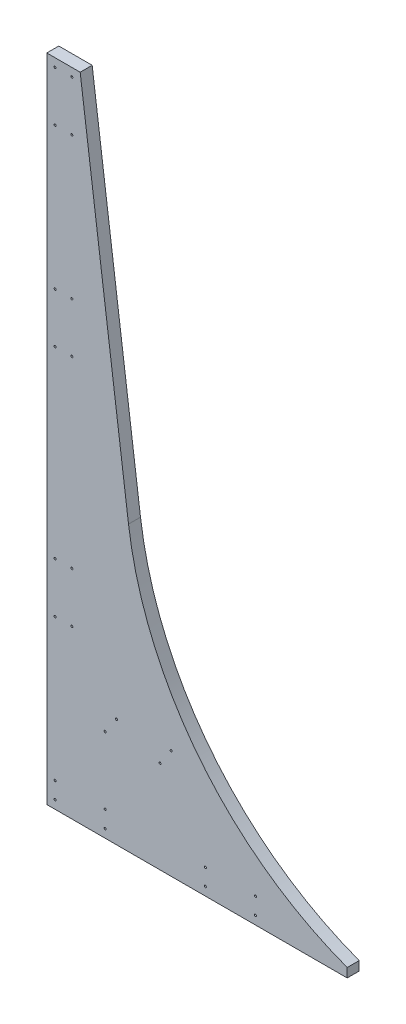
ISO-10303-21;
HEADER;
FILE_DESCRIPTION(('STEP AP214'),'2;1');
FILE_NAME('part.step','',(''),(''),'','','');
FILE_SCHEMA(('AUTOMOTIVE_DESIGN { 1 0 10303 214 1 1 1 1 }'));
ENDSEC;
DATA;
#1=APPLICATION_CONTEXT('core data for automotive mechanical design processes');
#2=APPLICATION_PROTOCOL_DEFINITION('international standard','automotive_design',2000,#1);
#3=PRODUCT_CONTEXT('',#1,'mechanical');
#4=PRODUCT('Part','Part','',(#3));
#5=PRODUCT_RELATED_PRODUCT_CATEGORY('part','',(#4));
#6=PRODUCT_DEFINITION_FORMATION('','',#4);
#7=PRODUCT_DEFINITION_CONTEXT('part definition',#1,'design');
#8=PRODUCT_DEFINITION('design','',#6,#7);
#9=PRODUCT_DEFINITION_SHAPE('','',#8);
#10=(LENGTH_UNIT() NAMED_UNIT(*) SI_UNIT(.MILLI.,.METRE.));
#11=(NAMED_UNIT(*) PLANE_ANGLE_UNIT() SI_UNIT($,.RADIAN.));
#12=(NAMED_UNIT(*) SI_UNIT($,.STERADIAN.) SOLID_ANGLE_UNIT());
#13=UNCERTAINTY_MEASURE_WITH_UNIT(LENGTH_MEASURE(1.E-05),#10,'distance_accuracy_value','');
#14=(GEOMETRIC_REPRESENTATION_CONTEXT(3) GLOBAL_UNCERTAINTY_ASSIGNED_CONTEXT((#13)) GLOBAL_UNIT_ASSIGNED_CONTEXT((#10,
#11,#12)) REPRESENTATION_CONTEXT('',''));
#15=CARTESIAN_POINT('',(0.,0.,0.));
#16=DIRECTION('',(0.,0.,1.));
#17=DIRECTION('',(1.,0.,0.));
#18=AXIS2_PLACEMENT_3D('',#15,#16,#17);
#19=CARTESIAN_POINT('',(638.116559349375,499.436357901165,18.25625));
#20=DIRECTION('',(0.,0.,-1.));
#21=DIRECTION('',(-1.,0.,0.));
#22=AXIS2_PLACEMENT_3D('',#19,#20,#21);
#23=CYLINDRICAL_SURFACE('',#22,518.182264806593);
#24=CARTESIAN_POINT('',(638.116559349375,499.436357901165,0.));
#25=DIRECTION('',(0.,0.,1.));
#26=DIRECTION('',(1.,0.,0.));
#27=AXIS2_PLACEMENT_3D('',#24,#25,#26);
#28=CIRCLE('',#27,518.182264806593);
#29=CARTESIAN_POINT('',(124.367415651835,431.8,0.));
#30=VERTEX_POINT('',#29);
#31=CARTESIAN_POINT('',(457.201,13.8620382080899,0.));
#32=VERTEX_POINT('',#31);
#33=EDGE_CURVE('E152',#30,#32,#28,.T.);
#34=ORIENTED_EDGE('',*,*,#33,.F.);
#35=DIRECTION('',(0.,0.,-1.));
#36=VECTOR('',#35,1.);
#37=CARTESIAN_POINT('',(124.367415651835,431.8,18.25625));
#38=LINE('',#37,#36);
#39=CARTESIAN_POINT('',(124.367415651835,431.8,18.25625));
#40=VERTEX_POINT('',#39);
#41=EDGE_CURVE('E13',#40,#30,#38,.T.);
#42=ORIENTED_EDGE('',*,*,#41,.F.);
#43=CARTESIAN_POINT('',(638.116559349375,499.436357901165,18.25625));
#44=DIRECTION('',(0.,0.,1.));
#45=DIRECTION('',(1.,0.,0.));
#46=AXIS2_PLACEMENT_3D('',#43,#44,#45);
#47=CIRCLE('',#46,518.182264806593);
#48=CARTESIAN_POINT('',(457.201,13.8620382080899,18.25625));
#49=VERTEX_POINT('',#48);
#50=EDGE_CURVE('E173',#40,#49,#47,.T.);
#51=ORIENTED_EDGE('',*,*,#50,.T.);
#52=DIRECTION('',(0.,0.,-1.));
#53=VECTOR('',#52,1.);
#54=CARTESIAN_POINT('',(457.201,13.8620382080899,18.25625));
#55=LINE('',#54,#53);
#56=EDGE_CURVE('E75',#49,#32,#55,.T.);
#57=ORIENTED_EDGE('',*,*,#56,.T.);
#58=EDGE_LOOP('',(#34,#42,#51,#57));
#59=FACE_BOUND('',#58,.T.);
#60=ADVANCED_FACE('F58',(#59),#23,.F.);
#61=CARTESIAN_POINT('',(178.127589027018,23.4509419846275,18.25625));
#62=DIRECTION('',(0.991444861373811,0.130526192220048,0.));
#63=DIRECTION('',(-0.130526192220048,0.991444861373811,0.));
#64=AXIS2_PLACEMENT_3D('',#61,#62,#63);
#65=PLANE('',#64);
#66=DIRECTION('',(0.130526192220048,-0.991444861373811,0.));
#67=VECTOR('',#66,1.);
#68=CARTESIAN_POINT('',(178.127589027018,23.4509419846275,0.));
#69=LINE('',#68,#67);
#70=CARTESIAN_POINT('',(50.8,990.6,0.));
#71=VERTEX_POINT('',#70);
#72=EDGE_CURVE('E155',#71,#30,#69,.T.);
#73=ORIENTED_EDGE('',*,*,#72,.F.);
#74=DIRECTION('',(0.,0.,-1.));
#75=VECTOR('',#74,1.);
#76=CARTESIAN_POINT('',(50.8,990.6,18.25625));
#77=LINE('',#76,#75);
#78=CARTESIAN_POINT('',(50.8,990.6,18.25625));
#79=VERTEX_POINT('',#78);
#80=EDGE_CURVE('E67',#79,#71,#77,.T.);
#81=ORIENTED_EDGE('',*,*,#80,.F.);
#82=DIRECTION('',(0.130526192220048,-0.991444861373811,0.));
#83=VECTOR('',#82,1.);
#84=CARTESIAN_POINT('',(178.127589027018,23.4509419846275,18.25625));
#85=LINE('',#84,#83);
#86=EDGE_CURVE('E146',#79,#40,#85,.T.);
#87=ORIENTED_EDGE('',*,*,#86,.T.);
#88=ORIENTED_EDGE('',*,*,#41,.T.);
#89=EDGE_LOOP('',(#73,#81,#87,#88));
#90=FACE_BOUND('',#89,.T.);
#91=ADVANCED_FACE('F186',(#90),#65,.T.);
#92=CARTESIAN_POINT('',(0.,990.6,18.25625));
#93=DIRECTION('',(0.,1.,0.));
#94=DIRECTION('',(0.,0.,1.));
#95=AXIS2_PLACEMENT_3D('',#92,#93,#94);
#96=PLANE('',#95);
#97=DIRECTION('',(1.,0.,0.));
#98=VECTOR('',#97,1.);
#99=CARTESIAN_POINT('',(0.,990.6,0.));
#100=LINE('',#99,#98);
#101=CARTESIAN_POINT('',(0.,990.6,0.));
#102=VERTEX_POINT('',#101);
#103=EDGE_CURVE('E160',#102,#71,#100,.T.);
#104=ORIENTED_EDGE('',*,*,#103,.F.);
#105=DIRECTION('',(0.,0.,-1.));
#106=VECTOR('',#105,1.);
#107=CARTESIAN_POINT('',(0.,990.6,18.25625));
#108=LINE('',#107,#106);
#109=CARTESIAN_POINT('',(0.,990.6,18.25625));
#110=VERTEX_POINT('',#109);
#111=EDGE_CURVE('E129',#110,#102,#108,.T.);
#112=ORIENTED_EDGE('',*,*,#111,.F.);
#113=DIRECTION('',(1.,0.,0.));
#114=VECTOR('',#113,1.);
#115=CARTESIAN_POINT('',(0.,990.6,18.25625));
#116=LINE('',#115,#114);
#117=EDGE_CURVE('E142',#110,#79,#116,.T.);
#118=ORIENTED_EDGE('',*,*,#117,.T.);
#119=ORIENTED_EDGE('',*,*,#80,.T.);
#120=EDGE_LOOP('',(#104,#112,#118,#119));
#121=FACE_BOUND('',#120,.T.);
#122=ADVANCED_FACE('F183',(#121),#96,.T.);
#123=CARTESIAN_POINT('',(0.,0.,18.25625));
#124=DIRECTION('',(-1.,0.,0.));
#125=DIRECTION('',(0.,0.,1.));
#126=AXIS2_PLACEMENT_3D('',#123,#124,#125);
#127=PLANE('',#126);
#128=DIRECTION('',(0.,1.,0.));
#129=VECTOR('',#128,1.);
#130=CARTESIAN_POINT('',(0.,0.,0.));
#131=LINE('',#130,#129);
#132=CARTESIAN_POINT('',(0.,0.,0.));
#133=VERTEX_POINT('',#132);
#134=EDGE_CURVE('E125',#133,#102,#131,.T.);
#135=ORIENTED_EDGE('',*,*,#134,.F.);
#136=DIRECTION('',(0.,0.,-1.));
#137=VECTOR('',#136,1.);
#138=CARTESIAN_POINT('',(0.,0.,18.25625));
#139=LINE('',#138,#137);
#140=CARTESIAN_POINT('',(0.,0.,18.25625));
#141=VERTEX_POINT('',#140);
#142=EDGE_CURVE('E119',#141,#133,#139,.T.);
#143=ORIENTED_EDGE('',*,*,#142,.F.);
#144=DIRECTION('',(0.,1.,0.));
#145=VECTOR('',#144,1.);
#146=CARTESIAN_POINT('',(0.,0.,18.25625));
#147=LINE('',#146,#145);
#148=EDGE_CURVE('E123',#141,#110,#147,.T.);
#149=ORIENTED_EDGE('',*,*,#148,.T.);
#150=ORIENTED_EDGE('',*,*,#111,.T.);
#151=EDGE_LOOP('',(#135,#143,#149,#150));
#152=FACE_BOUND('',#151,.T.);
#153=ADVANCED_FACE('F121',(#152),#127,.T.);
#154=CARTESIAN_POINT('',(0.,0.,18.25625));
#155=DIRECTION('',(0.,1.,0.));
#156=DIRECTION('',(0.,0.,1.));
#157=AXIS2_PLACEMENT_3D('',#154,#155,#156);
#158=PLANE('',#157);
#159=DIRECTION('',(1.,0.,0.));
#160=VECTOR('',#159,1.);
#161=CARTESIAN_POINT('',(0.,0.,0.));
#162=LINE('',#161,#160);
#163=CARTESIAN_POINT('',(457.201,0.,0.));
#164=VERTEX_POINT('',#163);
#165=EDGE_CURVE('E166',#133,#164,#162,.T.);
#166=ORIENTED_EDGE('',*,*,#165,.T.);
#167=DIRECTION('',(0.,0.,-1.));
#168=VECTOR('',#167,1.);
#169=CARTESIAN_POINT('',(457.201,0.,18.25625));
#170=LINE('',#169,#168);
#171=CARTESIAN_POINT('',(457.201,0.,18.25625));
#172=VERTEX_POINT('',#171);
#173=EDGE_CURVE('E97',#172,#164,#170,.T.);
#174=ORIENTED_EDGE('',*,*,#173,.F.);
#175=DIRECTION('',(1.,0.,0.));
#176=VECTOR('',#175,1.);
#177=CARTESIAN_POINT('',(0.,0.,18.25625));
#178=LINE('',#177,#176);
#179=EDGE_CURVE('E131',#141,#172,#178,.T.);
#180=ORIENTED_EDGE('',*,*,#179,.F.);
#181=ORIENTED_EDGE('',*,*,#142,.T.);
#182=EDGE_LOOP('',(#166,#174,#180,#181));
#183=FACE_BOUND('',#182,.T.);
#184=ADVANCED_FACE('F132',(#183),#158,.F.);
#185=CARTESIAN_POINT('',(457.201,0.,18.25625));
#186=DIRECTION('',(1.,0.,0.));
#187=DIRECTION('',(0.,0.,-1.));
#188=AXIS2_PLACEMENT_3D('',#185,#186,#187);
#189=PLANE('',#188);
#190=DIRECTION('',(0.,-1.,0.));
#191=VECTOR('',#190,1.);
#192=CARTESIAN_POINT('',(457.201,0.,0.));
#193=LINE('',#192,#191);
#194=EDGE_CURVE('E169',#32,#164,#193,.T.);
#195=ORIENTED_EDGE('',*,*,#194,.F.);
#196=ORIENTED_EDGE('',*,*,#56,.F.);
#197=DIRECTION('',(0.,-1.,0.));
#198=VECTOR('',#197,1.);
#199=CARTESIAN_POINT('',(457.201,0.,18.25625));
#200=LINE('',#199,#198);
#201=EDGE_CURVE('E136',#49,#172,#200,.T.);
#202=ORIENTED_EDGE('',*,*,#201,.T.);
#203=ORIENTED_EDGE('',*,*,#173,.T.);
#204=EDGE_LOOP('',(#195,#196,#202,#203));
#205=FACE_BOUND('',#204,.T.);
#206=ADVANCED_FACE('F189',(#205),#189,.T.);
#207=CARTESIAN_POINT('',(0.,0.,18.25625));
#208=DIRECTION('',(0.,0.,1.));
#209=DIRECTION('',(1.,0.,0.));
#210=AXIS2_PLACEMENT_3D('',#207,#208,#209);
#211=PLANE('',#210);
#212=CARTESIAN_POINT('',(88.9,140.661027566061,18.25625));
#213=DIRECTION('',(0.,0.,1.));
#214=DIRECTION('',(1.,0.,0.));
#215=AXIS2_PLACEMENT_3D('',#212,#213,#214);
#216=CIRCLE('',#215,1.5875);
#217=CARTESIAN_POINT('',(90.4875,140.661027566061,18.25625));
#218=VERTEX_POINT('',#217);
#219=EDGE_CURVE('E737',#218,#218,#216,.T.);
#220=ORIENTED_EDGE('',*,*,#219,.F.);
#221=EDGE_LOOP('',(#220));
#222=FACE_BOUND('',#221,.T.);
#223=CARTESIAN_POINT('',(106.1212,165.426027566061,18.25625));
#224=DIRECTION('',(0.,0.,1.));
#225=DIRECTION('',(1.,0.,0.));
#226=AXIS2_PLACEMENT_3D('',#223,#224,#225);
#227=CIRCLE('',#226,1.58749999999999);
#228=CARTESIAN_POINT('',(107.7087,165.426027566061,18.25625));
#229=VERTEX_POINT('',#228);
#230=EDGE_CURVE('E731',#229,#229,#227,.T.);
#231=ORIENTED_EDGE('',*,*,#230,.F.);
#232=EDGE_LOOP('',(#231));
#233=FACE_BOUND('',#232,.T.);
#234=CARTESIAN_POINT('',(189.3316,165.426027566061,18.25625));
#235=DIRECTION('',(0.,0.,1.));
#236=DIRECTION('',(1.,0.,0.));
#237=AXIS2_PLACEMENT_3D('',#234,#235,#236);
#238=CIRCLE('',#237,1.58749999999999);
#239=CARTESIAN_POINT('',(190.9191,165.426027566061,18.25625));
#240=VERTEX_POINT('',#239);
#241=EDGE_CURVE('E725',#240,#240,#238,.T.);
#242=ORIENTED_EDGE('',*,*,#241,.F.);
#243=EDGE_LOOP('',(#242));
#244=FACE_BOUND('',#243,.T.);
#245=CARTESIAN_POINT('',(172.1104,140.661027566061,18.25625));
#246=DIRECTION('',(0.,0.,1.));
#247=DIRECTION('',(1.,0.,0.));
#248=AXIS2_PLACEMENT_3D('',#245,#246,#247);
#249=CIRCLE('',#248,1.58749999999999);
#250=CARTESIAN_POINT('',(173.6979,140.661027566061,18.25625));
#251=VERTEX_POINT('',#250);
#252=EDGE_CURVE('E719',#251,#251,#249,.T.);
#253=ORIENTED_EDGE('',*,*,#252,.F.);
#254=EDGE_LOOP('',(#253));
#255=FACE_BOUND('',#254,.T.);
#256=CARTESIAN_POINT('',(12.7000000000001,38.0999999999999,18.25625));
#257=DIRECTION('',(0.,0.,1.));
#258=DIRECTION('',(1.,0.,0.));
#259=AXIS2_PLACEMENT_3D('',#256,#257,#258);
#260=CIRCLE('',#259,1.5875);
#261=CARTESIAN_POINT('',(14.2875000000001,38.0999999999999,18.25625));
#262=VERTEX_POINT('',#261);
#263=EDGE_CURVE('E665',#262,#262,#260,.T.);
#264=ORIENTED_EDGE('',*,*,#263,.F.);
#265=EDGE_LOOP('',(#264));
#266=FACE_BOUND('',#265,.T.);
#267=CARTESIAN_POINT('',(38.1000000000001,330.2,18.25625));
#268=DIRECTION('',(0.,0.,1.));
#269=DIRECTION('',(1.,0.,0.));
#270=AXIS2_PLACEMENT_3D('',#267,#268,#269);
#271=CIRCLE('',#270,1.58750000000001);
#272=CARTESIAN_POINT('',(39.6875000000001,330.2,18.25625));
#273=VERTEX_POINT('',#272);
#274=EDGE_CURVE('E671',#273,#273,#271,.T.);
#275=ORIENTED_EDGE('',*,*,#274,.F.);
#276=EDGE_LOOP('',(#275));
#277=FACE_BOUND('',#276,.T.);
#278=CARTESIAN_POINT('',(12.7000000000001,330.2,18.25625));
#279=DIRECTION('',(0.,0.,1.));
#280=DIRECTION('',(1.,0.,0.));
#281=AXIS2_PLACEMENT_3D('',#278,#279,#280);
#282=CIRCLE('',#281,1.5875);
#283=CARTESIAN_POINT('',(14.2875000000001,330.2,18.25625));
#284=VERTEX_POINT('',#283);
#285=EDGE_CURVE('E653',#284,#284,#282,.T.);
#286=ORIENTED_EDGE('',*,*,#285,.F.);
#287=EDGE_LOOP('',(#286));
#288=FACE_BOUND('',#287,.T.);
#289=CARTESIAN_POINT('',(38.1000000000001,254.,18.25625));
#290=DIRECTION('',(0.,0.,1.));
#291=DIRECTION('',(1.,0.,0.));
#292=AXIS2_PLACEMENT_3D('',#289,#290,#291);
#293=CIRCLE('',#292,1.58750000000006);
#294=CARTESIAN_POINT('',(39.6875000000001,254.,18.25625));
#295=VERTEX_POINT('',#294);
#296=EDGE_CURVE('E659',#295,#295,#293,.T.);
#297=ORIENTED_EDGE('',*,*,#296,.F.);
#298=EDGE_LOOP('',(#297));
#299=FACE_BOUND('',#298,.T.);
#300=CARTESIAN_POINT('',(241.3,38.0999999999999,18.25625));
#301=DIRECTION('',(0.,0.,1.));
#302=DIRECTION('',(1.,0.,0.));
#303=AXIS2_PLACEMENT_3D('',#300,#301,#302);
#304=CIRCLE('',#303,1.58749999999999);
#305=CARTESIAN_POINT('',(242.8875,38.0999999999999,18.25625));
#306=VERTEX_POINT('',#305);
#307=EDGE_CURVE('E689',#306,#306,#304,.T.);
#308=ORIENTED_EDGE('',*,*,#307,.F.);
#309=EDGE_LOOP('',(#308));
#310=FACE_BOUND('',#309,.T.);
#311=CARTESIAN_POINT('',(88.9000000000001,12.6999999999999,18.25625));
#312=DIRECTION('',(0.,0.,1.));
#313=DIRECTION('',(1.,0.,0.));
#314=AXIS2_PLACEMENT_3D('',#311,#312,#313);
#315=CIRCLE('',#314,1.58749999999998);
#316=CARTESIAN_POINT('',(90.4875000000001,12.6999999999999,18.25625));
#317=VERTEX_POINT('',#316);
#318=EDGE_CURVE('E695',#317,#317,#315,.T.);
#319=ORIENTED_EDGE('',*,*,#318,.F.);
#320=EDGE_LOOP('',(#319));
#321=FACE_BOUND('',#320,.T.);
#322=CARTESIAN_POINT('',(88.9000000000001,38.0999999999999,18.25625));
#323=DIRECTION('',(0.,0.,1.));
#324=DIRECTION('',(1.,0.,0.));
#325=AXIS2_PLACEMENT_3D('',#322,#323,#324);
#326=CIRCLE('',#325,1.58749999999999);
#327=CARTESIAN_POINT('',(90.4875000000001,38.0999999999999,18.25625));
#328=VERTEX_POINT('',#327);
#329=EDGE_CURVE('E677',#328,#328,#326,.T.);
#330=ORIENTED_EDGE('',*,*,#329,.F.);
#331=EDGE_LOOP('',(#330));
#332=FACE_BOUND('',#331,.T.);
#333=CARTESIAN_POINT('',(12.7000000000001,12.6999999999999,18.25625));
#334=DIRECTION('',(0.,0.,1.));
#335=DIRECTION('',(1.,0.,0.));
#336=AXIS2_PLACEMENT_3D('',#333,#334,#335);
#337=CIRCLE('',#336,1.5875);
#338=CARTESIAN_POINT('',(14.2875000000001,12.6999999999999,18.25625));
#339=VERTEX_POINT('',#338);
#340=EDGE_CURVE('E683',#339,#339,#337,.T.);
#341=ORIENTED_EDGE('',*,*,#340,.F.);
#342=EDGE_LOOP('',(#341));
#343=FACE_BOUND('',#342,.T.);
#344=CARTESIAN_POINT('',(12.7,609.6,18.25625));
#345=DIRECTION('',(0.,0.,1.));
#346=DIRECTION('',(1.,0.,0.));
#347=AXIS2_PLACEMENT_3D('',#344,#345,#346);
#348=CIRCLE('',#347,1.58750000000007);
#349=CARTESIAN_POINT('',(14.2875000000001,609.6,18.25625));
#350=VERTEX_POINT('',#349);
#351=EDGE_CURVE('E617',#350,#350,#348,.T.);
#352=ORIENTED_EDGE('',*,*,#351,.F.);
#353=EDGE_LOOP('',(#352));
#354=FACE_BOUND('',#353,.T.);
#355=CARTESIAN_POINT('',(38.1,901.7,18.25625));
#356=DIRECTION('',(0.,0.,1.));
#357=DIRECTION('',(1.,0.,0.));
#358=AXIS2_PLACEMENT_3D('',#355,#356,#357);
#359=CIRCLE('',#358,1.58750000000008);
#360=CARTESIAN_POINT('',(39.6875000000001,901.7,18.25625));
#361=VERTEX_POINT('',#360);
#362=EDGE_CURVE('E623',#361,#361,#359,.T.);
#363=ORIENTED_EDGE('',*,*,#362,.F.);
#364=EDGE_LOOP('',(#363));
#365=FACE_BOUND('',#364,.T.);
#366=CARTESIAN_POINT('',(12.7,901.7,18.25625));
#367=DIRECTION('',(0.,0.,1.));
#368=DIRECTION('',(1.,0.,0.));
#369=AXIS2_PLACEMENT_3D('',#366,#367,#368);
#370=CIRCLE('',#369,1.58750000000007);
#371=CARTESIAN_POINT('',(14.2875000000001,901.7,18.25625));
#372=VERTEX_POINT('',#371);
#373=EDGE_CURVE('E602',#372,#372,#370,.T.);
#374=ORIENTED_EDGE('',*,*,#373,.F.);
#375=EDGE_LOOP('',(#374));
#376=FACE_BOUND('',#375,.T.);
#377=CARTESIAN_POINT('',(38.1,977.9,18.25625));
#378=DIRECTION('',(0.,0.,1.));
#379=DIRECTION('',(1.,0.,0.));
#380=AXIS2_PLACEMENT_3D('',#377,#378,#379);
#381=CIRCLE('',#380,1.58750000000007);
#382=CARTESIAN_POINT('',(39.6875000000001,977.9,18.25625));
#383=VERTEX_POINT('',#382);
#384=EDGE_CURVE('E611',#383,#383,#381,.T.);
#385=ORIENTED_EDGE('',*,*,#384,.F.);
#386=EDGE_LOOP('',(#385));
#387=FACE_BOUND('',#386,.T.);
#388=CARTESIAN_POINT('',(12.7000000000001,254.,18.25625));
#389=DIRECTION('',(0.,0.,1.));
#390=DIRECTION('',(1.,0.,0.));
#391=AXIS2_PLACEMENT_3D('',#388,#389,#390);
#392=CIRCLE('',#391,1.58750000000002);
#393=CARTESIAN_POINT('',(14.2875000000001,254.,18.25625));
#394=VERTEX_POINT('',#393);
#395=EDGE_CURVE('E641',#394,#394,#392,.T.);
#396=ORIENTED_EDGE('',*,*,#395,.F.);
#397=EDGE_LOOP('',(#396));
#398=FACE_BOUND('',#397,.T.);
#399=CARTESIAN_POINT('',(38.1,685.8,18.25625));
#400=DIRECTION('',(0.,0.,1.));
#401=DIRECTION('',(1.,0.,0.));
#402=AXIS2_PLACEMENT_3D('',#399,#400,#401);
#403=CIRCLE('',#402,1.58750000000007);
#404=CARTESIAN_POINT('',(39.6875000000001,685.8,18.25625));
#405=VERTEX_POINT('',#404);
#406=EDGE_CURVE('E647',#405,#405,#403,.T.);
#407=ORIENTED_EDGE('',*,*,#406,.F.);
#408=EDGE_LOOP('',(#407));
#409=FACE_BOUND('',#408,.T.);
#410=CARTESIAN_POINT('',(12.7,685.8,18.25625));
#411=DIRECTION('',(0.,0.,1.));
#412=DIRECTION('',(1.,0.,0.));
#413=AXIS2_PLACEMENT_3D('',#410,#411,#412);
#414=CIRCLE('',#413,1.58750000000004);
#415=CARTESIAN_POINT('',(14.2875000000001,685.8,18.25625));
#416=VERTEX_POINT('',#415);
#417=EDGE_CURVE('E629',#416,#416,#414,.T.);
#418=ORIENTED_EDGE('',*,*,#417,.F.);
#419=EDGE_LOOP('',(#418));
#420=FACE_BOUND('',#419,.T.);
#421=CARTESIAN_POINT('',(38.1000000000001,609.6,18.25625));
#422=DIRECTION('',(0.,0.,1.));
#423=DIRECTION('',(1.,0.,0.));
#424=AXIS2_PLACEMENT_3D('',#421,#422,#423);
#425=CIRCLE('',#424,1.58750000000007);
#426=CARTESIAN_POINT('',(39.6875000000001,609.6,18.25625));
#427=VERTEX_POINT('',#426);
#428=EDGE_CURVE('E635',#427,#427,#425,.T.);
#429=ORIENTED_EDGE('',*,*,#428,.F.);
#430=EDGE_LOOP('',(#429));
#431=FACE_BOUND('',#430,.T.);
#432=CARTESIAN_POINT('',(317.5,12.6999999999999,18.25625));
#433=DIRECTION('',(0.,0.,1.));
#434=DIRECTION('',(1.,0.,0.));
#435=AXIS2_PLACEMENT_3D('',#432,#433,#434);
#436=CIRCLE('',#435,1.58750000000004);
#437=CARTESIAN_POINT('',(319.0875,12.6999999999999,18.25625));
#438=VERTEX_POINT('',#437);
#439=EDGE_CURVE('E713',#438,#438,#436,.T.);
#440=ORIENTED_EDGE('',*,*,#439,.F.);
#441=EDGE_LOOP('',(#440));
#442=FACE_BOUND('',#441,.T.);
#443=CARTESIAN_POINT('',(241.3,12.6999999999999,18.25625));
#444=DIRECTION('',(0.,0.,1.));
#445=DIRECTION('',(1.,0.,0.));
#446=AXIS2_PLACEMENT_3D('',#443,#444,#445);
#447=CIRCLE('',#446,1.58749999999999);
#448=CARTESIAN_POINT('',(242.8875,12.6999999999999,18.25625));
#449=VERTEX_POINT('',#448);
#450=EDGE_CURVE('E701',#449,#449,#447,.T.);
#451=ORIENTED_EDGE('',*,*,#450,.F.);
#452=EDGE_LOOP('',(#451));
#453=FACE_BOUND('',#452,.T.);
#454=CARTESIAN_POINT('',(317.5,38.0999999999999,18.25625));
#455=DIRECTION('',(0.,0.,1.));
#456=DIRECTION('',(1.,0.,0.));
#457=AXIS2_PLACEMENT_3D('',#454,#455,#456);
#458=CIRCLE('',#457,1.58750000000004);
#459=CARTESIAN_POINT('',(319.0875,38.0999999999999,18.25625));
#460=VERTEX_POINT('',#459);
#461=EDGE_CURVE('E707',#460,#460,#458,.T.);
#462=ORIENTED_EDGE('',*,*,#461,.F.);
#463=EDGE_LOOP('',(#462));
#464=FACE_BOUND('',#463,.T.);
#465=CARTESIAN_POINT('',(12.7,977.9,18.25625));
#466=DIRECTION('',(0.,0.,1.));
#467=DIRECTION('',(1.,0.,0.));
#468=AXIS2_PLACEMENT_3D('',#465,#466,#467);
#469=CIRCLE('',#468,1.58750000000004);
#470=CARTESIAN_POINT('',(14.2875,977.9,18.25625));
#471=VERTEX_POINT('',#470);
#472=EDGE_CURVE('E596',#471,#471,#469,.T.);
#473=ORIENTED_EDGE('',*,*,#472,.F.);
#474=EDGE_LOOP('',(#473));
#475=FACE_BOUND('',#474,.T.);
#476=ORIENTED_EDGE('',*,*,#50,.F.);
#477=ORIENTED_EDGE('',*,*,#86,.F.);
#478=ORIENTED_EDGE('',*,*,#117,.F.);
#479=ORIENTED_EDGE('',*,*,#148,.F.);
#480=ORIENTED_EDGE('',*,*,#179,.T.);
#481=ORIENTED_EDGE('',*,*,#201,.F.);
#482=EDGE_LOOP('',(#476,#477,#478,#479,#480,#481));
#483=FACE_BOUND('',#482,.T.);
#484=ADVANCED_FACE('F139',(#222,#233,#244,#255,#266,#277,#288,#299,#310,#321,#332,#343,#354,
#365,#376,#387,#398,#409,#420,#431,#442,#453,#464,#475,#483),#211,.T.);
#485=CARTESIAN_POINT('',(0.,0.,0.));
#486=DIRECTION('',(0.,0.,1.));
#487=DIRECTION('',(1.,0.,0.));
#488=AXIS2_PLACEMENT_3D('',#485,#486,#487);
#489=PLANE('',#488);
#490=CARTESIAN_POINT('',(88.9,140.661027566061,0.));
#491=DIRECTION('',(0.,0.,1.));
#492=DIRECTION('',(1.,0.,0.));
#493=AXIS2_PLACEMENT_3D('',#490,#491,#492);
#494=CIRCLE('',#493,1.5875);
#495=CARTESIAN_POINT('',(90.4875,140.661027566061,0.));
#496=VERTEX_POINT('',#495);
#497=EDGE_CURVE('E504',#496,#496,#494,.T.);
#498=ORIENTED_EDGE('',*,*,#497,.T.);
#499=EDGE_LOOP('',(#498));
#500=FACE_BOUND('',#499,.T.);
#501=CARTESIAN_POINT('',(106.1212,165.426027566061,0.));
#502=DIRECTION('',(0.,0.,1.));
#503=DIRECTION('',(1.,0.,0.));
#504=AXIS2_PLACEMENT_3D('',#501,#502,#503);
#505=CIRCLE('',#504,1.58749999999999);
#506=CARTESIAN_POINT('',(107.7087,165.426027566061,0.));
#507=VERTEX_POINT('',#506);
#508=EDGE_CURVE('E508',#507,#507,#505,.T.);
#509=ORIENTED_EDGE('',*,*,#508,.T.);
#510=EDGE_LOOP('',(#509));
#511=FACE_BOUND('',#510,.T.);
#512=CARTESIAN_POINT('',(189.3316,165.426027566061,0.));
#513=DIRECTION('',(0.,0.,1.));
#514=DIRECTION('',(1.,0.,0.));
#515=AXIS2_PLACEMENT_3D('',#512,#513,#514);
#516=CIRCLE('',#515,1.58749999999999);
#517=CARTESIAN_POINT('',(190.9191,165.426027566061,0.));
#518=VERTEX_POINT('',#517);
#519=EDGE_CURVE('E512',#518,#518,#516,.T.);
#520=ORIENTED_EDGE('',*,*,#519,.T.);
#521=EDGE_LOOP('',(#520));
#522=FACE_BOUND('',#521,.T.);
#523=CARTESIAN_POINT('',(172.1104,140.661027566061,0.));
#524=DIRECTION('',(0.,0.,1.));
#525=DIRECTION('',(1.,0.,0.));
#526=AXIS2_PLACEMENT_3D('',#523,#524,#525);
#527=CIRCLE('',#526,1.58749999999999);
#528=CARTESIAN_POINT('',(173.6979,140.661027566061,0.));
#529=VERTEX_POINT('',#528);
#530=EDGE_CURVE('E516',#529,#529,#527,.T.);
#531=ORIENTED_EDGE('',*,*,#530,.T.);
#532=EDGE_LOOP('',(#531));
#533=FACE_BOUND('',#532,.T.);
#534=CARTESIAN_POINT('',(12.7000000000001,38.0999999999999,0.));
#535=DIRECTION('',(0.,0.,1.));
#536=DIRECTION('',(1.,0.,0.));
#537=AXIS2_PLACEMENT_3D('',#534,#535,#536);
#538=CIRCLE('',#537,1.5875);
#539=CARTESIAN_POINT('',(14.2875000000001,38.0999999999999,0.));
#540=VERTEX_POINT('',#539);
#541=EDGE_CURVE('E520',#540,#540,#538,.T.);
#542=ORIENTED_EDGE('',*,*,#541,.T.);
#543=EDGE_LOOP('',(#542));
#544=FACE_BOUND('',#543,.T.);
#545=CARTESIAN_POINT('',(38.1000000000001,330.2,0.));
#546=DIRECTION('',(0.,0.,1.));
#547=DIRECTION('',(1.,0.,0.));
#548=AXIS2_PLACEMENT_3D('',#545,#546,#547);
#549=CIRCLE('',#548,1.58750000000001);
#550=CARTESIAN_POINT('',(39.6875000000001,330.2,0.));
#551=VERTEX_POINT('',#550);
#552=EDGE_CURVE('E524',#551,#551,#549,.T.);
#553=ORIENTED_EDGE('',*,*,#552,.T.);
#554=EDGE_LOOP('',(#553));
#555=FACE_BOUND('',#554,.T.);
#556=CARTESIAN_POINT('',(12.7000000000001,330.2,0.));
#557=DIRECTION('',(0.,0.,1.));
#558=DIRECTION('',(1.,0.,0.));
#559=AXIS2_PLACEMENT_3D('',#556,#557,#558);
#560=CIRCLE('',#559,1.5875);
#561=CARTESIAN_POINT('',(14.2875000000001,330.2,0.));
#562=VERTEX_POINT('',#561);
#563=EDGE_CURVE('E528',#562,#562,#560,.T.);
#564=ORIENTED_EDGE('',*,*,#563,.T.);
#565=EDGE_LOOP('',(#564));
#566=FACE_BOUND('',#565,.T.);
#567=CARTESIAN_POINT('',(38.1000000000001,254.,0.));
#568=DIRECTION('',(0.,0.,1.));
#569=DIRECTION('',(1.,0.,0.));
#570=AXIS2_PLACEMENT_3D('',#567,#568,#569);
#571=CIRCLE('',#570,1.58750000000006);
#572=CARTESIAN_POINT('',(39.6875000000001,254.,0.));
#573=VERTEX_POINT('',#572);
#574=EDGE_CURVE('E532',#573,#573,#571,.T.);
#575=ORIENTED_EDGE('',*,*,#574,.T.);
#576=EDGE_LOOP('',(#575));
#577=FACE_BOUND('',#576,.T.);
#578=CARTESIAN_POINT('',(241.3,38.0999999999999,0.));
#579=DIRECTION('',(0.,0.,1.));
#580=DIRECTION('',(1.,0.,0.));
#581=AXIS2_PLACEMENT_3D('',#578,#579,#580);
#582=CIRCLE('',#581,1.58749999999999);
#583=CARTESIAN_POINT('',(242.8875,38.0999999999999,0.));
#584=VERTEX_POINT('',#583);
#585=EDGE_CURVE('E536',#584,#584,#582,.T.);
#586=ORIENTED_EDGE('',*,*,#585,.T.);
#587=EDGE_LOOP('',(#586));
#588=FACE_BOUND('',#587,.T.);
#589=CARTESIAN_POINT('',(88.9000000000001,12.6999999999999,0.));
#590=DIRECTION('',(0.,0.,1.));
#591=DIRECTION('',(1.,0.,0.));
#592=AXIS2_PLACEMENT_3D('',#589,#590,#591);
#593=CIRCLE('',#592,1.58749999999998);
#594=CARTESIAN_POINT('',(90.4875000000001,12.6999999999999,0.));
#595=VERTEX_POINT('',#594);
#596=EDGE_CURVE('E540',#595,#595,#593,.T.);
#597=ORIENTED_EDGE('',*,*,#596,.T.);
#598=EDGE_LOOP('',(#597));
#599=FACE_BOUND('',#598,.T.);
#600=CARTESIAN_POINT('',(88.9000000000001,38.0999999999999,0.));
#601=DIRECTION('',(0.,0.,1.));
#602=DIRECTION('',(1.,0.,0.));
#603=AXIS2_PLACEMENT_3D('',#600,#601,#602);
#604=CIRCLE('',#603,1.58749999999999);
#605=CARTESIAN_POINT('',(90.4875000000001,38.0999999999999,0.));
#606=VERTEX_POINT('',#605);
#607=EDGE_CURVE('E544',#606,#606,#604,.T.);
#608=ORIENTED_EDGE('',*,*,#607,.T.);
#609=EDGE_LOOP('',(#608));
#610=FACE_BOUND('',#609,.T.);
#611=CARTESIAN_POINT('',(12.7000000000001,12.6999999999999,0.));
#612=DIRECTION('',(0.,0.,1.));
#613=DIRECTION('',(1.,0.,0.));
#614=AXIS2_PLACEMENT_3D('',#611,#612,#613);
#615=CIRCLE('',#614,1.5875);
#616=CARTESIAN_POINT('',(14.2875000000001,12.6999999999999,0.));
#617=VERTEX_POINT('',#616);
#618=EDGE_CURVE('E548',#617,#617,#615,.T.);
#619=ORIENTED_EDGE('',*,*,#618,.T.);
#620=EDGE_LOOP('',(#619));
#621=FACE_BOUND('',#620,.T.);
#622=CARTESIAN_POINT('',(12.7,609.6,0.));
#623=DIRECTION('',(0.,0.,1.));
#624=DIRECTION('',(1.,0.,0.));
#625=AXIS2_PLACEMENT_3D('',#622,#623,#624);
#626=CIRCLE('',#625,1.58750000000007);
#627=CARTESIAN_POINT('',(14.2875000000001,609.6,0.));
#628=VERTEX_POINT('',#627);
#629=EDGE_CURVE('E552',#628,#628,#626,.T.);
#630=ORIENTED_EDGE('',*,*,#629,.T.);
#631=EDGE_LOOP('',(#630));
#632=FACE_BOUND('',#631,.T.);
#633=CARTESIAN_POINT('',(38.1,901.7,0.));
#634=DIRECTION('',(0.,0.,1.));
#635=DIRECTION('',(1.,0.,0.));
#636=AXIS2_PLACEMENT_3D('',#633,#634,#635);
#637=CIRCLE('',#636,1.58750000000008);
#638=CARTESIAN_POINT('',(39.6875000000001,901.7,0.));
#639=VERTEX_POINT('',#638);
#640=EDGE_CURVE('E556',#639,#639,#637,.T.);
#641=ORIENTED_EDGE('',*,*,#640,.T.);
#642=EDGE_LOOP('',(#641));
#643=FACE_BOUND('',#642,.T.);
#644=CARTESIAN_POINT('',(12.7,901.7,0.));
#645=DIRECTION('',(0.,0.,1.));
#646=DIRECTION('',(1.,0.,0.));
#647=AXIS2_PLACEMENT_3D('',#644,#645,#646);
#648=CIRCLE('',#647,1.58750000000007);
#649=CARTESIAN_POINT('',(14.2875000000001,901.7,0.));
#650=VERTEX_POINT('',#649);
#651=EDGE_CURVE('E560',#650,#650,#648,.T.);
#652=ORIENTED_EDGE('',*,*,#651,.T.);
#653=EDGE_LOOP('',(#652));
#654=FACE_BOUND('',#653,.T.);
#655=CARTESIAN_POINT('',(38.1,977.9,0.));
#656=DIRECTION('',(0.,0.,1.));
#657=DIRECTION('',(1.,0.,0.));
#658=AXIS2_PLACEMENT_3D('',#655,#656,#657);
#659=CIRCLE('',#658,1.58750000000007);
#660=CARTESIAN_POINT('',(39.6875000000001,977.9,0.));
#661=VERTEX_POINT('',#660);
#662=EDGE_CURVE('E564',#661,#661,#659,.T.);
#663=ORIENTED_EDGE('',*,*,#662,.T.);
#664=EDGE_LOOP('',(#663));
#665=FACE_BOUND('',#664,.T.);
#666=CARTESIAN_POINT('',(12.7000000000001,254.,0.));
#667=DIRECTION('',(0.,0.,1.));
#668=DIRECTION('',(1.,0.,0.));
#669=AXIS2_PLACEMENT_3D('',#666,#667,#668);
#670=CIRCLE('',#669,1.58750000000002);
#671=CARTESIAN_POINT('',(14.2875000000001,254.,0.));
#672=VERTEX_POINT('',#671);
#673=EDGE_CURVE('E568',#672,#672,#670,.T.);
#674=ORIENTED_EDGE('',*,*,#673,.T.);
#675=EDGE_LOOP('',(#674));
#676=FACE_BOUND('',#675,.T.);
#677=CARTESIAN_POINT('',(38.1,685.8,0.));
#678=DIRECTION('',(0.,0.,1.));
#679=DIRECTION('',(1.,0.,0.));
#680=AXIS2_PLACEMENT_3D('',#677,#678,#679);
#681=CIRCLE('',#680,1.58750000000007);
#682=CARTESIAN_POINT('',(39.6875000000001,685.8,0.));
#683=VERTEX_POINT('',#682);
#684=EDGE_CURVE('E572',#683,#683,#681,.T.);
#685=ORIENTED_EDGE('',*,*,#684,.T.);
#686=EDGE_LOOP('',(#685));
#687=FACE_BOUND('',#686,.T.);
#688=CARTESIAN_POINT('',(12.7,685.8,0.));
#689=DIRECTION('',(0.,0.,1.));
#690=DIRECTION('',(1.,0.,0.));
#691=AXIS2_PLACEMENT_3D('',#688,#689,#690);
#692=CIRCLE('',#691,1.58750000000004);
#693=CARTESIAN_POINT('',(14.2875000000001,685.8,0.));
#694=VERTEX_POINT('',#693);
#695=EDGE_CURVE('E576',#694,#694,#692,.T.);
#696=ORIENTED_EDGE('',*,*,#695,.T.);
#697=EDGE_LOOP('',(#696));
#698=FACE_BOUND('',#697,.T.);
#699=CARTESIAN_POINT('',(38.1000000000001,609.6,0.));
#700=DIRECTION('',(0.,0.,1.));
#701=DIRECTION('',(1.,0.,0.));
#702=AXIS2_PLACEMENT_3D('',#699,#700,#701);
#703=CIRCLE('',#702,1.58750000000007);
#704=CARTESIAN_POINT('',(39.6875000000001,609.6,0.));
#705=VERTEX_POINT('',#704);
#706=EDGE_CURVE('E580',#705,#705,#703,.T.);
#707=ORIENTED_EDGE('',*,*,#706,.T.);
#708=EDGE_LOOP('',(#707));
#709=FACE_BOUND('',#708,.T.);
#710=CARTESIAN_POINT('',(317.5,12.6999999999999,0.));
#711=DIRECTION('',(0.,0.,1.));
#712=DIRECTION('',(1.,0.,0.));
#713=AXIS2_PLACEMENT_3D('',#710,#711,#712);
#714=CIRCLE('',#713,1.58750000000004);
#715=CARTESIAN_POINT('',(319.0875,12.6999999999999,0.));
#716=VERTEX_POINT('',#715);
#717=EDGE_CURVE('E584',#716,#716,#714,.T.);
#718=ORIENTED_EDGE('',*,*,#717,.T.);
#719=EDGE_LOOP('',(#718));
#720=FACE_BOUND('',#719,.T.);
#721=CARTESIAN_POINT('',(241.3,12.6999999999999,0.));
#722=DIRECTION('',(0.,0.,1.));
#723=DIRECTION('',(1.,0.,0.));
#724=AXIS2_PLACEMENT_3D('',#721,#722,#723);
#725=CIRCLE('',#724,1.58749999999999);
#726=CARTESIAN_POINT('',(242.8875,12.6999999999999,0.));
#727=VERTEX_POINT('',#726);
#728=EDGE_CURVE('E588',#727,#727,#725,.T.);
#729=ORIENTED_EDGE('',*,*,#728,.T.);
#730=EDGE_LOOP('',(#729));
#731=FACE_BOUND('',#730,.T.);
#732=CARTESIAN_POINT('',(317.5,38.0999999999999,0.));
#733=DIRECTION('',(0.,0.,1.));
#734=DIRECTION('',(1.,0.,0.));
#735=AXIS2_PLACEMENT_3D('',#732,#733,#734);
#736=CIRCLE('',#735,1.58750000000004);
#737=CARTESIAN_POINT('',(319.0875,38.0999999999999,0.));
#738=VERTEX_POINT('',#737);
#739=EDGE_CURVE('E592',#738,#738,#736,.T.);
#740=ORIENTED_EDGE('',*,*,#739,.T.);
#741=EDGE_LOOP('',(#740));
#742=FACE_BOUND('',#741,.T.);
#743=CARTESIAN_POINT('',(12.7,977.9,0.));
#744=DIRECTION('',(0.,0.,1.));
#745=DIRECTION('',(1.,0.,0.));
#746=AXIS2_PLACEMENT_3D('',#743,#744,#745);
#747=CIRCLE('',#746,1.58750000000004);
#748=CARTESIAN_POINT('',(14.2875,977.9,0.));
#749=VERTEX_POINT('',#748);
#750=EDGE_CURVE('E156',#749,#749,#747,.T.);
#751=ORIENTED_EDGE('',*,*,#750,.T.);
#752=EDGE_LOOP('',(#751));
#753=FACE_BOUND('',#752,.T.);
#754=ORIENTED_EDGE('',*,*,#33,.T.);
#755=ORIENTED_EDGE('',*,*,#194,.T.);
#756=ORIENTED_EDGE('',*,*,#165,.F.);
#757=ORIENTED_EDGE('',*,*,#134,.T.);
#758=ORIENTED_EDGE('',*,*,#103,.T.);
#759=ORIENTED_EDGE('',*,*,#72,.T.);
#760=EDGE_LOOP('',(#754,#755,#756,#757,#758,#759));
#761=FACE_BOUND('',#760,.T.);
#762=ADVANCED_FACE('F188',(#500,#511,#522,#533,#544,#555,#566,#577,#588,#599,#610,#621,#632,
#643,#654,#665,#676,#687,#698,#709,#720,#731,#742,#753,#761),#489,.F.);
#763=CARTESIAN_POINT('',(12.7,977.9,0.));
#764=DIRECTION('',(0.,0.,1.));
#765=DIRECTION('',(1.,0.,0.));
#766=AXIS2_PLACEMENT_3D('',#763,#764,#765);
#767=CYLINDRICAL_SURFACE('',#766,1.58750000000004);
#768=ORIENTED_EDGE('',*,*,#750,.F.);
#769=EDGE_LOOP('',(#768));
#770=FACE_BOUND('',#769,.T.);
#771=ORIENTED_EDGE('',*,*,#472,.T.);
#772=EDGE_LOOP('',(#771));
#773=FACE_BOUND('',#772,.T.);
#774=ADVANCED_FACE('F398',(#770,#773),#767,.F.);
#775=CARTESIAN_POINT('',(317.5,38.0999999999999,0.));
#776=DIRECTION('',(0.,0.,1.));
#777=DIRECTION('',(1.,0.,0.));
#778=AXIS2_PLACEMENT_3D('',#775,#776,#777);
#779=CYLINDRICAL_SURFACE('',#778,1.58750000000004);
#780=ORIENTED_EDGE('',*,*,#739,.F.);
#781=EDGE_LOOP('',(#780));
#782=FACE_BOUND('',#781,.T.);
#783=ORIENTED_EDGE('',*,*,#461,.T.);
#784=EDGE_LOOP('',(#783));
#785=FACE_BOUND('',#784,.T.);
#786=ADVANCED_FACE('F390',(#782,#785),#779,.F.);
#787=CARTESIAN_POINT('',(241.3,12.6999999999999,0.));
#788=DIRECTION('',(0.,0.,1.));
#789=DIRECTION('',(1.,0.,0.));
#790=AXIS2_PLACEMENT_3D('',#787,#788,#789);
#791=CYLINDRICAL_SURFACE('',#790,1.58749999999999);
#792=ORIENTED_EDGE('',*,*,#728,.F.);
#793=EDGE_LOOP('',(#792));
#794=FACE_BOUND('',#793,.T.);
#795=ORIENTED_EDGE('',*,*,#450,.T.);
#796=EDGE_LOOP('',(#795));
#797=FACE_BOUND('',#796,.T.);
#798=ADVANCED_FACE('F382',(#794,#797),#791,.F.);
#799=CARTESIAN_POINT('',(317.5,12.6999999999999,0.));
#800=DIRECTION('',(0.,0.,1.));
#801=DIRECTION('',(1.,0.,0.));
#802=AXIS2_PLACEMENT_3D('',#799,#800,#801);
#803=CYLINDRICAL_SURFACE('',#802,1.58750000000004);
#804=ORIENTED_EDGE('',*,*,#717,.F.);
#805=EDGE_LOOP('',(#804));
#806=FACE_BOUND('',#805,.T.);
#807=ORIENTED_EDGE('',*,*,#439,.T.);
#808=EDGE_LOOP('',(#807));
#809=FACE_BOUND('',#808,.T.);
#810=ADVANCED_FACE('F374',(#806,#809),#803,.F.);
#811=CARTESIAN_POINT('',(38.1000000000001,609.6,0.));
#812=DIRECTION('',(0.,0.,1.));
#813=DIRECTION('',(1.,0.,0.));
#814=AXIS2_PLACEMENT_3D('',#811,#812,#813);
#815=CYLINDRICAL_SURFACE('',#814,1.58750000000007);
#816=ORIENTED_EDGE('',*,*,#706,.F.);
#817=EDGE_LOOP('',(#816));
#818=FACE_BOUND('',#817,.T.);
#819=ORIENTED_EDGE('',*,*,#428,.T.);
#820=EDGE_LOOP('',(#819));
#821=FACE_BOUND('',#820,.T.);
#822=ADVANCED_FACE('F366',(#818,#821),#815,.F.);
#823=CARTESIAN_POINT('',(12.7,685.8,0.));
#824=DIRECTION('',(0.,0.,1.));
#825=DIRECTION('',(1.,0.,0.));
#826=AXIS2_PLACEMENT_3D('',#823,#824,#825);
#827=CYLINDRICAL_SURFACE('',#826,1.58750000000004);
#828=ORIENTED_EDGE('',*,*,#695,.F.);
#829=EDGE_LOOP('',(#828));
#830=FACE_BOUND('',#829,.T.);
#831=ORIENTED_EDGE('',*,*,#417,.T.);
#832=EDGE_LOOP('',(#831));
#833=FACE_BOUND('',#832,.T.);
#834=ADVANCED_FACE('F358',(#830,#833),#827,.F.);
#835=CARTESIAN_POINT('',(38.1,685.8,0.));
#836=DIRECTION('',(0.,0.,1.));
#837=DIRECTION('',(1.,0.,0.));
#838=AXIS2_PLACEMENT_3D('',#835,#836,#837);
#839=CYLINDRICAL_SURFACE('',#838,1.58750000000007);
#840=ORIENTED_EDGE('',*,*,#684,.F.);
#841=EDGE_LOOP('',(#840));
#842=FACE_BOUND('',#841,.T.);
#843=ORIENTED_EDGE('',*,*,#406,.T.);
#844=EDGE_LOOP('',(#843));
#845=FACE_BOUND('',#844,.T.);
#846=ADVANCED_FACE('F350',(#842,#845),#839,.F.);
#847=CARTESIAN_POINT('',(12.7000000000001,254.,0.));
#848=DIRECTION('',(0.,0.,1.));
#849=DIRECTION('',(1.,0.,0.));
#850=AXIS2_PLACEMENT_3D('',#847,#848,#849);
#851=CYLINDRICAL_SURFACE('',#850,1.58750000000002);
#852=ORIENTED_EDGE('',*,*,#673,.F.);
#853=EDGE_LOOP('',(#852));
#854=FACE_BOUND('',#853,.T.);
#855=ORIENTED_EDGE('',*,*,#395,.T.);
#856=EDGE_LOOP('',(#855));
#857=FACE_BOUND('',#856,.T.);
#858=ADVANCED_FACE('F342',(#854,#857),#851,.F.);
#859=CARTESIAN_POINT('',(38.1,977.9,0.));
#860=DIRECTION('',(0.,0.,1.));
#861=DIRECTION('',(1.,0.,0.));
#862=AXIS2_PLACEMENT_3D('',#859,#860,#861);
#863=CYLINDRICAL_SURFACE('',#862,1.58750000000007);
#864=ORIENTED_EDGE('',*,*,#662,.F.);
#865=EDGE_LOOP('',(#864));
#866=FACE_BOUND('',#865,.T.);
#867=ORIENTED_EDGE('',*,*,#384,.T.);
#868=EDGE_LOOP('',(#867));
#869=FACE_BOUND('',#868,.T.);
#870=ADVANCED_FACE('F334',(#866,#869),#863,.F.);
#871=CARTESIAN_POINT('',(12.7,901.7,0.));
#872=DIRECTION('',(0.,0.,1.));
#873=DIRECTION('',(1.,0.,0.));
#874=AXIS2_PLACEMENT_3D('',#871,#872,#873);
#875=CYLINDRICAL_SURFACE('',#874,1.58750000000007);
#876=ORIENTED_EDGE('',*,*,#651,.F.);
#877=EDGE_LOOP('',(#876));
#878=FACE_BOUND('',#877,.T.);
#879=ORIENTED_EDGE('',*,*,#373,.T.);
#880=EDGE_LOOP('',(#879));
#881=FACE_BOUND('',#880,.T.);
#882=ADVANCED_FACE('F326',(#878,#881),#875,.F.);
#883=CARTESIAN_POINT('',(38.1,901.7,0.));
#884=DIRECTION('',(0.,0.,1.));
#885=DIRECTION('',(1.,0.,0.));
#886=AXIS2_PLACEMENT_3D('',#883,#884,#885);
#887=CYLINDRICAL_SURFACE('',#886,1.58750000000008);
#888=ORIENTED_EDGE('',*,*,#640,.F.);
#889=EDGE_LOOP('',(#888));
#890=FACE_BOUND('',#889,.T.);
#891=ORIENTED_EDGE('',*,*,#362,.T.);
#892=EDGE_LOOP('',(#891));
#893=FACE_BOUND('',#892,.T.);
#894=ADVANCED_FACE('F318',(#890,#893),#887,.F.);
#895=CARTESIAN_POINT('',(12.7,609.6,0.));
#896=DIRECTION('',(0.,0.,1.));
#897=DIRECTION('',(1.,0.,0.));
#898=AXIS2_PLACEMENT_3D('',#895,#896,#897);
#899=CYLINDRICAL_SURFACE('',#898,1.58750000000007);
#900=ORIENTED_EDGE('',*,*,#629,.F.);
#901=EDGE_LOOP('',(#900));
#902=FACE_BOUND('',#901,.T.);
#903=ORIENTED_EDGE('',*,*,#351,.T.);
#904=EDGE_LOOP('',(#903));
#905=FACE_BOUND('',#904,.T.);
#906=ADVANCED_FACE('F310',(#902,#905),#899,.F.);
#907=CARTESIAN_POINT('',(12.7000000000001,12.6999999999999,0.));
#908=DIRECTION('',(0.,0.,1.));
#909=DIRECTION('',(1.,0.,0.));
#910=AXIS2_PLACEMENT_3D('',#907,#908,#909);
#911=CYLINDRICAL_SURFACE('',#910,1.5875);
#912=ORIENTED_EDGE('',*,*,#618,.F.);
#913=EDGE_LOOP('',(#912));
#914=FACE_BOUND('',#913,.T.);
#915=ORIENTED_EDGE('',*,*,#340,.T.);
#916=EDGE_LOOP('',(#915));
#917=FACE_BOUND('',#916,.T.);
#918=ADVANCED_FACE('F302',(#914,#917),#911,.F.);
#919=CARTESIAN_POINT('',(88.9000000000001,38.0999999999999,0.));
#920=DIRECTION('',(0.,0.,1.));
#921=DIRECTION('',(1.,0.,0.));
#922=AXIS2_PLACEMENT_3D('',#919,#920,#921);
#923=CYLINDRICAL_SURFACE('',#922,1.58749999999999);
#924=ORIENTED_EDGE('',*,*,#607,.F.);
#925=EDGE_LOOP('',(#924));
#926=FACE_BOUND('',#925,.T.);
#927=ORIENTED_EDGE('',*,*,#329,.T.);
#928=EDGE_LOOP('',(#927));
#929=FACE_BOUND('',#928,.T.);
#930=ADVANCED_FACE('F294',(#926,#929),#923,.F.);
#931=CARTESIAN_POINT('',(88.9000000000001,12.6999999999999,0.));
#932=DIRECTION('',(0.,0.,1.));
#933=DIRECTION('',(1.,0.,0.));
#934=AXIS2_PLACEMENT_3D('',#931,#932,#933);
#935=CYLINDRICAL_SURFACE('',#934,1.58749999999998);
#936=ORIENTED_EDGE('',*,*,#596,.F.);
#937=EDGE_LOOP('',(#936));
#938=FACE_BOUND('',#937,.T.);
#939=ORIENTED_EDGE('',*,*,#318,.T.);
#940=EDGE_LOOP('',(#939));
#941=FACE_BOUND('',#940,.T.);
#942=ADVANCED_FACE('F286',(#938,#941),#935,.F.);
#943=CARTESIAN_POINT('',(241.3,38.0999999999999,0.));
#944=DIRECTION('',(0.,0.,1.));
#945=DIRECTION('',(1.,0.,0.));
#946=AXIS2_PLACEMENT_3D('',#943,#944,#945);
#947=CYLINDRICAL_SURFACE('',#946,1.58749999999999);
#948=ORIENTED_EDGE('',*,*,#585,.F.);
#949=EDGE_LOOP('',(#948));
#950=FACE_BOUND('',#949,.T.);
#951=ORIENTED_EDGE('',*,*,#307,.T.);
#952=EDGE_LOOP('',(#951));
#953=FACE_BOUND('',#952,.T.);
#954=ADVANCED_FACE('F278',(#950,#953),#947,.F.);
#955=CARTESIAN_POINT('',(38.1000000000001,254.,0.));
#956=DIRECTION('',(0.,0.,1.));
#957=DIRECTION('',(1.,0.,0.));
#958=AXIS2_PLACEMENT_3D('',#955,#956,#957);
#959=CYLINDRICAL_SURFACE('',#958,1.58750000000006);
#960=ORIENTED_EDGE('',*,*,#574,.F.);
#961=EDGE_LOOP('',(#960));
#962=FACE_BOUND('',#961,.T.);
#963=ORIENTED_EDGE('',*,*,#296,.T.);
#964=EDGE_LOOP('',(#963));
#965=FACE_BOUND('',#964,.T.);
#966=ADVANCED_FACE('F270',(#962,#965),#959,.F.);
#967=CARTESIAN_POINT('',(12.7000000000001,330.2,0.));
#968=DIRECTION('',(0.,0.,1.));
#969=DIRECTION('',(1.,0.,0.));
#970=AXIS2_PLACEMENT_3D('',#967,#968,#969);
#971=CYLINDRICAL_SURFACE('',#970,1.5875);
#972=ORIENTED_EDGE('',*,*,#563,.F.);
#973=EDGE_LOOP('',(#972));
#974=FACE_BOUND('',#973,.T.);
#975=ORIENTED_EDGE('',*,*,#285,.T.);
#976=EDGE_LOOP('',(#975));
#977=FACE_BOUND('',#976,.T.);
#978=ADVANCED_FACE('F262',(#974,#977),#971,.F.);
#979=CARTESIAN_POINT('',(38.1000000000001,330.2,0.));
#980=DIRECTION('',(0.,0.,1.));
#981=DIRECTION('',(1.,0.,0.));
#982=AXIS2_PLACEMENT_3D('',#979,#980,#981);
#983=CYLINDRICAL_SURFACE('',#982,1.58750000000001);
#984=ORIENTED_EDGE('',*,*,#552,.F.);
#985=EDGE_LOOP('',(#984));
#986=FACE_BOUND('',#985,.T.);
#987=ORIENTED_EDGE('',*,*,#274,.T.);
#988=EDGE_LOOP('',(#987));
#989=FACE_BOUND('',#988,.T.);
#990=ADVANCED_FACE('F253',(#986,#989),#983,.F.);
#991=CARTESIAN_POINT('',(12.7000000000001,38.0999999999999,0.));
#992=DIRECTION('',(0.,0.,1.));
#993=DIRECTION('',(1.,0.,0.));
#994=AXIS2_PLACEMENT_3D('',#991,#992,#993);
#995=CYLINDRICAL_SURFACE('',#994,1.5875);
#996=ORIENTED_EDGE('',*,*,#541,.F.);
#997=EDGE_LOOP('',(#996));
#998=FACE_BOUND('',#997,.T.);
#999=ORIENTED_EDGE('',*,*,#263,.T.);
#1000=EDGE_LOOP('',(#999));
#1001=FACE_BOUND('',#1000,.T.);
#1002=ADVANCED_FACE('F244',(#998,#1001),#995,.F.);
#1003=CARTESIAN_POINT('',(172.1104,140.661027566061,0.));
#1004=DIRECTION('',(0.,0.,1.));
#1005=DIRECTION('',(1.,0.,0.));
#1006=AXIS2_PLACEMENT_3D('',#1003,#1004,#1005);
#1007=CYLINDRICAL_SURFACE('',#1006,1.58749999999999);
#1008=ORIENTED_EDGE('',*,*,#530,.F.);
#1009=EDGE_LOOP('',(#1008));
#1010=FACE_BOUND('',#1009,.T.);
#1011=ORIENTED_EDGE('',*,*,#252,.T.);
#1012=EDGE_LOOP('',(#1011));
#1013=FACE_BOUND('',#1012,.T.);
#1014=ADVANCED_FACE('F236',(#1010,#1013),#1007,.F.);
#1015=CARTESIAN_POINT('',(189.3316,165.426027566061,0.));
#1016=DIRECTION('',(0.,0.,1.));
#1017=DIRECTION('',(1.,0.,0.));
#1018=AXIS2_PLACEMENT_3D('',#1015,#1016,#1017);
#1019=CYLINDRICAL_SURFACE('',#1018,1.58749999999999);
#1020=ORIENTED_EDGE('',*,*,#519,.F.);
#1021=EDGE_LOOP('',(#1020));
#1022=FACE_BOUND('',#1021,.T.);
#1023=ORIENTED_EDGE('',*,*,#241,.T.);
#1024=EDGE_LOOP('',(#1023));
#1025=FACE_BOUND('',#1024,.T.);
#1026=ADVANCED_FACE('F228',(#1022,#1025),#1019,.F.);
#1027=CARTESIAN_POINT('',(106.1212,165.426027566061,0.));
#1028=DIRECTION('',(0.,0.,1.));
#1029=DIRECTION('',(1.,0.,0.));
#1030=AXIS2_PLACEMENT_3D('',#1027,#1028,#1029);
#1031=CYLINDRICAL_SURFACE('',#1030,1.58749999999999);
#1032=ORIENTED_EDGE('',*,*,#508,.F.);
#1033=EDGE_LOOP('',(#1032));
#1034=FACE_BOUND('',#1033,.T.);
#1035=ORIENTED_EDGE('',*,*,#230,.T.);
#1036=EDGE_LOOP('',(#1035));
#1037=FACE_BOUND('',#1036,.T.);
#1038=ADVANCED_FACE('F218',(#1034,#1037),#1031,.F.);
#1039=CARTESIAN_POINT('',(88.9,140.661027566061,0.));
#1040=DIRECTION('',(0.,0.,1.));
#1041=DIRECTION('',(1.,0.,0.));
#1042=AXIS2_PLACEMENT_3D('',#1039,#1040,#1041);
#1043=CYLINDRICAL_SURFACE('',#1042,1.5875);
#1044=ORIENTED_EDGE('',*,*,#497,.F.);
#1045=EDGE_LOOP('',(#1044));
#1046=FACE_BOUND('',#1045,.T.);
#1047=ORIENTED_EDGE('',*,*,#219,.T.);
#1048=EDGE_LOOP('',(#1047));
#1049=FACE_BOUND('',#1048,.T.);
#1050=ADVANCED_FACE('F215',(#1046,#1049),#1043,.F.);
#1051=CLOSED_SHELL('',(#60,#91,#122,#153,#184,#206,#484,#762,#774,#786,#798,#810,#822,#834,#846,
#858,#870,#882,#894,#906,#918,#930,#942,#954,#966,#978,#990,#1002,#1014,#1026,#1038,#1050));
#1052=MANIFOLD_SOLID_BREP('B2',#1051);
#1053=ADVANCED_BREP_SHAPE_REPRESENTATION('',(#18,#1052),#14);
#1054=SHAPE_DEFINITION_REPRESENTATION(#9,#1053);
ENDSEC;
END-ISO-10303-21;
